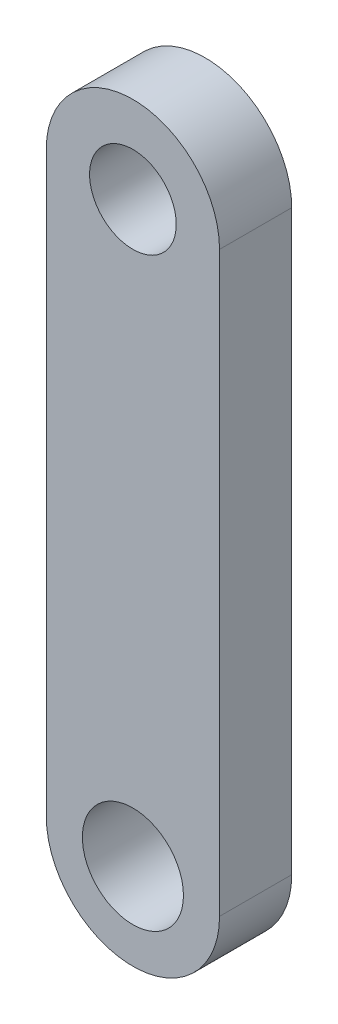
ISO-10303-21;
HEADER;
FILE_DESCRIPTION(('STEP AP214'),'2;1');
FILE_NAME('part.step','',(''),(''),'','','');
FILE_SCHEMA(('AUTOMOTIVE_DESIGN { 1 0 10303 214 1 1 1 1 }'));
ENDSEC;
DATA;
#1=APPLICATION_CONTEXT('core data for automotive mechanical design processes');
#2=APPLICATION_PROTOCOL_DEFINITION('international standard','automotive_design',2000,#1);
#3=PRODUCT_CONTEXT('',#1,'mechanical');
#4=PRODUCT('Part','Part','',(#3));
#5=PRODUCT_RELATED_PRODUCT_CATEGORY('part','',(#4));
#6=PRODUCT_DEFINITION_FORMATION('','',#4);
#7=PRODUCT_DEFINITION_CONTEXT('part definition',#1,'design');
#8=PRODUCT_DEFINITION('design','',#6,#7);
#9=PRODUCT_DEFINITION_SHAPE('','',#8);
#10=(LENGTH_UNIT() NAMED_UNIT(*) SI_UNIT(.MILLI.,.METRE.));
#11=(NAMED_UNIT(*) PLANE_ANGLE_UNIT() SI_UNIT($,.RADIAN.));
#12=(NAMED_UNIT(*) SI_UNIT($,.STERADIAN.) SOLID_ANGLE_UNIT());
#13=UNCERTAINTY_MEASURE_WITH_UNIT(LENGTH_MEASURE(1.E-05),#10,'distance_accuracy_value','');
#14=(GEOMETRIC_REPRESENTATION_CONTEXT(3) GLOBAL_UNCERTAINTY_ASSIGNED_CONTEXT((#13)) GLOBAL_UNIT_ASSIGNED_CONTEXT((#10,
#11,#12)) REPRESENTATION_CONTEXT('',''));
#15=CARTESIAN_POINT('',(0.,0.,0.));
#16=DIRECTION('',(0.,0.,1.));
#17=DIRECTION('',(1.,0.,0.));
#18=AXIS2_PLACEMENT_3D('',#15,#16,#17);
#19=CARTESIAN_POINT('',(-5.99999999999999,0.,5.));
#20=DIRECTION('',(-1.,0.,0.));
#21=DIRECTION('',(0.,0.,1.));
#22=AXIS2_PLACEMENT_3D('',#19,#20,#21);
#23=PLANE('',#22);
#24=DIRECTION('',(0.,1.,0.));
#25=VECTOR('',#24,1.);
#26=CARTESIAN_POINT('',(-5.99999999999999,0.,0.));
#27=LINE('',#26,#25);
#28=CARTESIAN_POINT('',(-5.99999999999999,-40.,0.));
#29=VERTEX_POINT('',#28);
#30=CARTESIAN_POINT('',(-5.99999999999999,0.,0.));
#31=VERTEX_POINT('',#30);
#32=EDGE_CURVE('E105',#29,#31,#27,.T.);
#33=ORIENTED_EDGE('',*,*,#32,.F.);
#34=DIRECTION('',(0.,0.,-1.));
#35=VECTOR('',#34,1.);
#36=CARTESIAN_POINT('',(-5.99999999999999,-40.,5.));
#37=LINE('',#36,#35);
#38=CARTESIAN_POINT('',(-5.99999999999999,-40.,5.));
#39=VERTEX_POINT('',#38);
#40=EDGE_CURVE('E11',#39,#29,#37,.T.);
#41=ORIENTED_EDGE('',*,*,#40,.F.);
#42=DIRECTION('',(0.,1.,0.));
#43=VECTOR('',#42,1.);
#44=CARTESIAN_POINT('',(-5.99999999999999,0.,5.));
#45=LINE('',#44,#43);
#46=CARTESIAN_POINT('',(-5.99999999999999,0.,5.));
#47=VERTEX_POINT('',#46);
#48=EDGE_CURVE('E91',#39,#47,#45,.T.);
#49=ORIENTED_EDGE('',*,*,#48,.T.);
#50=DIRECTION('',(0.,0.,-1.));
#51=VECTOR('',#50,1.);
#52=CARTESIAN_POINT('',(-5.99999999999999,0.,5.));
#53=LINE('',#52,#51);
#54=EDGE_CURVE('E73',#47,#31,#53,.T.);
#55=ORIENTED_EDGE('',*,*,#54,.T.);
#56=EDGE_LOOP('',(#33,#41,#49,#55));
#57=FACE_BOUND('',#56,.T.);
#58=ADVANCED_FACE('F34',(#57),#23,.T.);
#59=CARTESIAN_POINT('',(0.,-40.,5.));
#60=DIRECTION('',(0.,0.,-1.));
#61=DIRECTION('',(-1.,0.,0.));
#62=AXIS2_PLACEMENT_3D('',#59,#60,#61);
#63=CYLINDRICAL_SURFACE('',#62,6.);
#64=CARTESIAN_POINT('',(0.,-40.,0.));
#65=DIRECTION('',(0.,0.,1.));
#66=DIRECTION('',(1.,0.,0.));
#67=AXIS2_PLACEMENT_3D('',#64,#65,#66);
#68=CIRCLE('',#67,6.);
#69=CARTESIAN_POINT('',(6.00000000000001,-40.,0.));
#70=VERTEX_POINT('',#69);
#71=EDGE_CURVE('E96',#29,#70,#68,.T.);
#72=ORIENTED_EDGE('',*,*,#71,.T.);
#73=DIRECTION('',(0.,0.,-1.));
#74=VECTOR('',#73,1.);
#75=CARTESIAN_POINT('',(6.00000000000001,-40.,5.));
#76=LINE('',#75,#74);
#77=CARTESIAN_POINT('',(6.00000000000001,-40.,5.));
#78=VERTEX_POINT('',#77);
#79=EDGE_CURVE('E43',#78,#70,#76,.T.);
#80=ORIENTED_EDGE('',*,*,#79,.F.);
#81=CARTESIAN_POINT('',(0.,-40.,5.));
#82=DIRECTION('',(0.,0.,1.));
#83=DIRECTION('',(1.,0.,0.));
#84=AXIS2_PLACEMENT_3D('',#81,#82,#83);
#85=CIRCLE('',#84,6.);
#86=EDGE_CURVE('E88',#39,#78,#85,.T.);
#87=ORIENTED_EDGE('',*,*,#86,.F.);
#88=ORIENTED_EDGE('',*,*,#40,.T.);
#89=EDGE_LOOP('',(#72,#80,#87,#88));
#90=FACE_BOUND('',#89,.T.);
#91=ADVANCED_FACE('F94',(#90),#63,.T.);
#92=CARTESIAN_POINT('',(6.00000000000001,0.,5.));
#93=DIRECTION('',(-1.,0.,0.));
#94=DIRECTION('',(0.,0.,1.));
#95=AXIS2_PLACEMENT_3D('',#92,#93,#94);
#96=PLANE('',#95);
#97=DIRECTION('',(0.,1.,0.));
#98=VECTOR('',#97,1.);
#99=CARTESIAN_POINT('',(6.00000000000001,0.,0.));
#100=LINE('',#99,#98);
#101=CARTESIAN_POINT('',(6.00000000000001,0.,0.));
#102=VERTEX_POINT('',#101);
#103=EDGE_CURVE('E102',#70,#102,#100,.T.);
#104=ORIENTED_EDGE('',*,*,#103,.T.);
#105=DIRECTION('',(0.,0.,-1.));
#106=VECTOR('',#105,1.);
#107=CARTESIAN_POINT('',(6.00000000000001,0.,5.));
#108=LINE('',#107,#106);
#109=CARTESIAN_POINT('',(6.00000000000001,0.,5.));
#110=VERTEX_POINT('',#109);
#111=EDGE_CURVE('E87',#110,#102,#108,.T.);
#112=ORIENTED_EDGE('',*,*,#111,.F.);
#113=DIRECTION('',(0.,1.,0.));
#114=VECTOR('',#113,1.);
#115=CARTESIAN_POINT('',(6.00000000000001,0.,5.));
#116=LINE('',#115,#114);
#117=EDGE_CURVE('E81',#78,#110,#116,.T.);
#118=ORIENTED_EDGE('',*,*,#117,.F.);
#119=ORIENTED_EDGE('',*,*,#79,.T.);
#120=EDGE_LOOP('',(#104,#112,#118,#119));
#121=FACE_BOUND('',#120,.T.);
#122=ADVANCED_FACE('F84',(#121),#96,.F.);
#123=CARTESIAN_POINT('',(0.,0.,5.));
#124=DIRECTION('',(0.,0.,-1.));
#125=DIRECTION('',(-1.,0.,0.));
#126=AXIS2_PLACEMENT_3D('',#123,#124,#125);
#127=CYLINDRICAL_SURFACE('',#126,3.);
#128=CARTESIAN_POINT('',(0.,0.,5.));
#129=DIRECTION('',(0.,0.,1.));
#130=DIRECTION('',(1.,0.,0.));
#131=AXIS2_PLACEMENT_3D('',#128,#129,#130);
#132=CIRCLE('',#131,3.);
#133=CARTESIAN_POINT('',(3.,0.,5.));
#134=VERTEX_POINT('',#133);
#135=EDGE_CURVE('E115',#134,#134,#132,.T.);
#136=ORIENTED_EDGE('',*,*,#135,.T.);
#137=EDGE_LOOP('',(#136));
#138=FACE_BOUND('',#137,.T.);
#139=CARTESIAN_POINT('',(0.,0.,0.));
#140=DIRECTION('',(0.,0.,1.));
#141=DIRECTION('',(1.,0.,0.));
#142=AXIS2_PLACEMENT_3D('',#139,#140,#141);
#143=CIRCLE('',#142,3.);
#144=CARTESIAN_POINT('',(3.,0.,0.));
#145=VERTEX_POINT('',#144);
#146=EDGE_CURVE('E107',#145,#145,#143,.T.);
#147=ORIENTED_EDGE('',*,*,#146,.F.);
#148=EDGE_LOOP('',(#147));
#149=FACE_BOUND('',#148,.T.);
#150=ADVANCED_FACE('F130',(#138,#149),#127,.F.);
#151=CARTESIAN_POINT('',(0.,-40.,5.));
#152=DIRECTION('',(0.,0.,-1.));
#153=DIRECTION('',(-1.,0.,0.));
#154=AXIS2_PLACEMENT_3D('',#151,#152,#153);
#155=CYLINDRICAL_SURFACE('',#154,3.5);
#156=CARTESIAN_POINT('',(0.,-40.,5.));
#157=DIRECTION('',(0.,0.,1.));
#158=DIRECTION('',(1.,0.,0.));
#159=AXIS2_PLACEMENT_3D('',#156,#157,#158);
#160=CIRCLE('',#159,3.5);
#161=CARTESIAN_POINT('',(3.50000000000001,-40.,5.));
#162=VERTEX_POINT('',#161);
#163=EDGE_CURVE('E101',#162,#162,#160,.T.);
#164=ORIENTED_EDGE('',*,*,#163,.T.);
#165=EDGE_LOOP('',(#164));
#166=FACE_BOUND('',#165,.T.);
#167=CARTESIAN_POINT('',(0.,-40.,0.));
#168=DIRECTION('',(0.,0.,1.));
#169=DIRECTION('',(1.,0.,0.));
#170=AXIS2_PLACEMENT_3D('',#167,#168,#169);
#171=CIRCLE('',#170,3.5);
#172=CARTESIAN_POINT('',(3.50000000000001,-40.,0.));
#173=VERTEX_POINT('',#172);
#174=EDGE_CURVE('E110',#173,#173,#171,.T.);
#175=ORIENTED_EDGE('',*,*,#174,.F.);
#176=EDGE_LOOP('',(#175));
#177=FACE_BOUND('',#176,.T.);
#178=ADVANCED_FACE('F36',(#166,#177),#155,.F.);
#179=CARTESIAN_POINT('',(0.,0.,5.));
#180=DIRECTION('',(0.,0.,-1.));
#181=DIRECTION('',(-1.,0.,0.));
#182=AXIS2_PLACEMENT_3D('',#179,#180,#181);
#183=CYLINDRICAL_SURFACE('',#182,6.);
#184=CARTESIAN_POINT('',(0.,0.,0.));
#185=DIRECTION('',(0.,0.,1.));
#186=DIRECTION('',(1.,0.,0.));
#187=AXIS2_PLACEMENT_3D('',#184,#185,#186);
#188=CIRCLE('',#187,6.);
#189=EDGE_CURVE('E66',#102,#31,#188,.T.);
#190=ORIENTED_EDGE('',*,*,#189,.T.);
#191=ORIENTED_EDGE('',*,*,#54,.F.);
#192=CARTESIAN_POINT('',(0.,0.,5.));
#193=DIRECTION('',(0.,0.,1.));
#194=DIRECTION('',(1.,0.,0.));
#195=AXIS2_PLACEMENT_3D('',#192,#193,#194);
#196=CIRCLE('',#195,6.);
#197=EDGE_CURVE('E51',#110,#47,#196,.T.);
#198=ORIENTED_EDGE('',*,*,#197,.F.);
#199=ORIENTED_EDGE('',*,*,#111,.T.);
#200=EDGE_LOOP('',(#190,#191,#198,#199));
#201=FACE_BOUND('',#200,.T.);
#202=ADVANCED_FACE('F126',(#201),#183,.T.);
#203=CARTESIAN_POINT('',(0.,0.,5.));
#204=DIRECTION('',(0.,0.,1.));
#205=DIRECTION('',(1.,0.,0.));
#206=AXIS2_PLACEMENT_3D('',#203,#204,#205);
#207=PLANE('',#206);
#208=ORIENTED_EDGE('',*,*,#163,.F.);
#209=EDGE_LOOP('',(#208));
#210=FACE_BOUND('',#209,.T.);
#211=ORIENTED_EDGE('',*,*,#135,.F.);
#212=EDGE_LOOP('',(#211));
#213=FACE_BOUND('',#212,.T.);
#214=ORIENTED_EDGE('',*,*,#48,.F.);
#215=ORIENTED_EDGE('',*,*,#86,.T.);
#216=ORIENTED_EDGE('',*,*,#117,.T.);
#217=ORIENTED_EDGE('',*,*,#197,.T.);
#218=EDGE_LOOP('',(#214,#215,#216,#217));
#219=FACE_BOUND('',#218,.T.);
#220=ADVANCED_FACE('F90',(#210,#213,#219),#207,.T.);
#221=CARTESIAN_POINT('',(0.,0.,0.));
#222=DIRECTION('',(0.,0.,1.));
#223=DIRECTION('',(1.,0.,0.));
#224=AXIS2_PLACEMENT_3D('',#221,#222,#223);
#225=PLANE('',#224);
#226=ORIENTED_EDGE('',*,*,#174,.T.);
#227=EDGE_LOOP('',(#226));
#228=FACE_BOUND('',#227,.T.);
#229=ORIENTED_EDGE('',*,*,#146,.T.);
#230=EDGE_LOOP('',(#229));
#231=FACE_BOUND('',#230,.T.);
#232=ORIENTED_EDGE('',*,*,#32,.T.);
#233=ORIENTED_EDGE('',*,*,#189,.F.);
#234=ORIENTED_EDGE('',*,*,#103,.F.);
#235=ORIENTED_EDGE('',*,*,#71,.F.);
#236=EDGE_LOOP('',(#232,#233,#234,#235));
#237=FACE_BOUND('',#236,.T.);
#238=ADVANCED_FACE('F125',(#228,#231,#237),#225,.F.);
#239=CLOSED_SHELL('',(#58,#91,#122,#150,#178,#202,#220,#238));
#240=MANIFOLD_SOLID_BREP('B2',#239);
#241=ADVANCED_BREP_SHAPE_REPRESENTATION('',(#18,#240),#14);
#242=SHAPE_DEFINITION_REPRESENTATION(#9,#241);
ENDSEC;
END-ISO-10303-21;
